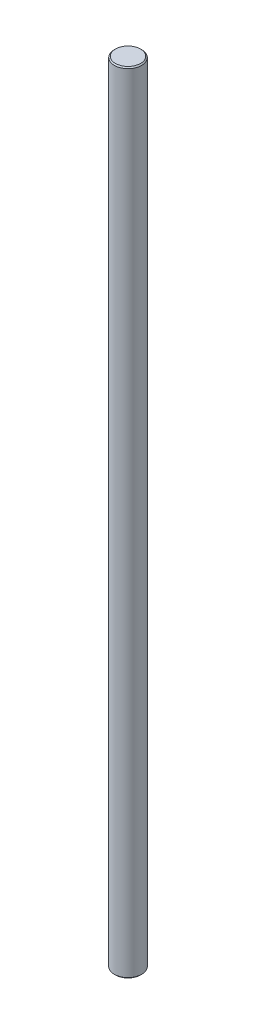
ISO-10303-21;
HEADER;
FILE_DESCRIPTION(('STEP AP214'),'2;1');
FILE_NAME('part.step','',(''),(''),'','','');
FILE_SCHEMA(('AUTOMOTIVE_DESIGN { 1 0 10303 214 1 1 1 1 }'));
ENDSEC;
DATA;
#1=APPLICATION_CONTEXT('core data for automotive mechanical design processes');
#2=APPLICATION_PROTOCOL_DEFINITION('international standard','automotive_design',2000,#1);
#3=PRODUCT_CONTEXT('',#1,'mechanical');
#4=PRODUCT('Part','Part','',(#3));
#5=PRODUCT_RELATED_PRODUCT_CATEGORY('part','',(#4));
#6=PRODUCT_DEFINITION_FORMATION('','',#4);
#7=PRODUCT_DEFINITION_CONTEXT('part definition',#1,'design');
#8=PRODUCT_DEFINITION('design','',#6,#7);
#9=PRODUCT_DEFINITION_SHAPE('','',#8);
#10=(LENGTH_UNIT() NAMED_UNIT(*) SI_UNIT(.MILLI.,.METRE.));
#11=(NAMED_UNIT(*) PLANE_ANGLE_UNIT() SI_UNIT($,.RADIAN.));
#12=(NAMED_UNIT(*) SI_UNIT($,.STERADIAN.) SOLID_ANGLE_UNIT());
#13=UNCERTAINTY_MEASURE_WITH_UNIT(LENGTH_MEASURE(1.E-05),#10,'distance_accuracy_value','');
#14=(GEOMETRIC_REPRESENTATION_CONTEXT(3) GLOBAL_UNCERTAINTY_ASSIGNED_CONTEXT((#13)) GLOBAL_UNIT_ASSIGNED_CONTEXT((#10,
#11,#12)) REPRESENTATION_CONTEXT('',''));
#15=CARTESIAN_POINT('',(0.,0.,0.));
#16=DIRECTION('',(0.,0.,1.));
#17=DIRECTION('',(1.,0.,0.));
#18=AXIS2_PLACEMENT_3D('',#15,#16,#17);
#19=CARTESIAN_POINT('',(-109.028784153227,330.558744459794,1.27442283479538));
#20=DIRECTION('',(0.,-1.,0.));
#21=DIRECTION('',(0.,0.,-1.));
#22=AXIS2_PLACEMENT_3D('',#19,#20,#21);
#23=CYLINDRICAL_SURFACE('',#22,5.99999999999997);
#24=CARTESIAN_POINT('',(-109.028784153227,313.088181711317,1.27442283479538));
#25=DIRECTION('',(0.,1.,0.));
#26=DIRECTION('',(0.,0.,1.));
#27=AXIS2_PLACEMENT_3D('',#24,#25,#26);
#28=CIRCLE('',#27,5.99999999999997);
#29=CARTESIAN_POINT('',(-109.028784153227,313.088181711317,-4.72557716520459));
#30=VERTEX_POINT('',#29);
#31=EDGE_CURVE('E38',#30,#30,#28,.F.);
#32=CARTESIAN_POINT('',(-109.028784153227,-32.4118182886832,1.27442283479537));
#33=DIRECTION('',(0.,1.,0.));
#34=DIRECTION('',(0.,0.,1.));
#35=AXIS2_PLACEMENT_3D('',#32,#33,#34);
#36=CIRCLE('',#35,5.99999999999997);
#37=CARTESIAN_POINT('',(-109.028784153227,-32.4118182886832,-4.72557716520461));
#38=VERTEX_POINT('',#37);
#39=EDGE_CURVE('E42',#38,#38,#36,.T.);
#40=CARTESIAN_POINT('',(-109.028784153227,313.088181711317,-4.72557716520459));
#41=CARTESIAN_POINT('',(-109.028784153227,309.489223377983,-4.72557716520459));
#42=CARTESIAN_POINT('',(-109.028784153227,305.89026504465,-4.72557716520459));
#43=CARTESIAN_POINT('',(-109.028784153227,298.692348377983,-4.72557716520459));
#44=CARTESIAN_POINT('',(-109.028784153227,295.09339004465,-4.72557716520459));
#45=CARTESIAN_POINT('',(-109.028784153227,287.895473377983,-4.72557716520459));
#46=CARTESIAN_POINT('',(-109.028784153227,284.29651504465,-4.72557716520459));
#47=CARTESIAN_POINT('',(-109.028784153227,277.098598377983,-4.72557716520459));
#48=CARTESIAN_POINT('',(-109.028784153227,273.49964004465,-4.72557716520459));
#49=CARTESIAN_POINT('',(-109.028784153227,266.301723377983,-4.72557716520459));
#50=CARTESIAN_POINT('',(-109.028784153227,262.70276504465,-4.7255771652046));
#51=CARTESIAN_POINT('',(-109.028784153227,255.504848377983,-4.7255771652046));
#52=CARTESIAN_POINT('',(-109.028784153227,251.90589004465,-4.7255771652046));
#53=CARTESIAN_POINT('',(-109.028784153227,244.707973377983,-4.7255771652046));
#54=CARTESIAN_POINT('',(-109.028784153227,241.10901504465,-4.7255771652046));
#55=CARTESIAN_POINT('',(-109.028784153227,233.911098377983,-4.7255771652046));
#56=CARTESIAN_POINT('',(-109.028784153227,230.31214004465,-4.7255771652046));
#57=CARTESIAN_POINT('',(-109.028784153227,223.114223377983,-4.7255771652046));
#58=CARTESIAN_POINT('',(-109.028784153227,219.51526504465,-4.7255771652046));
#59=CARTESIAN_POINT('',(-109.028784153227,212.317348377983,-4.7255771652046));
#60=CARTESIAN_POINT('',(-109.028784153227,208.71839004465,-4.7255771652046));
#61=CARTESIAN_POINT('',(-109.028784153227,201.520473377983,-4.7255771652046));
#62=CARTESIAN_POINT('',(-109.028784153227,197.92151504465,-4.7255771652046));
#63=CARTESIAN_POINT('',(-109.028784153227,190.723598377983,-4.7255771652046));
#64=CARTESIAN_POINT('',(-109.028784153227,187.12464004465,-4.7255771652046));
#65=CARTESIAN_POINT('',(-109.028784153227,179.926723377983,-4.7255771652046));
#66=CARTESIAN_POINT('',(-109.028784153227,176.32776504465,-4.7255771652046));
#67=CARTESIAN_POINT('',(-109.028784153227,169.129848377983,-4.7255771652046));
#68=CARTESIAN_POINT('',(-109.028784153227,165.53089004465,-4.7255771652046));
#69=CARTESIAN_POINT('',(-109.028784153227,158.332973377983,-4.7255771652046));
#70=CARTESIAN_POINT('',(-109.028784153227,154.73401504465,-4.7255771652046));
#71=CARTESIAN_POINT('',(-109.028784153227,147.536098377983,-4.7255771652046));
#72=CARTESIAN_POINT('',(-109.028784153227,143.93714004465,-4.7255771652046));
#73=CARTESIAN_POINT('',(-109.028784153227,136.739223377983,-4.7255771652046));
#74=CARTESIAN_POINT('',(-109.028784153227,133.14026504465,-4.7255771652046));
#75=CARTESIAN_POINT('',(-109.028784153227,125.942348377983,-4.7255771652046));
#76=CARTESIAN_POINT('',(-109.028784153227,122.34339004465,-4.7255771652046));
#77=CARTESIAN_POINT('',(-109.028784153227,115.145473377983,-4.7255771652046));
#78=CARTESIAN_POINT('',(-109.028784153227,111.54651504465,-4.7255771652046));
#79=CARTESIAN_POINT('',(-109.028784153227,104.348598377983,-4.7255771652046));
#80=CARTESIAN_POINT('',(-109.028784153227,100.74964004465,-4.7255771652046));
#81=CARTESIAN_POINT('',(-109.028784153227,93.5517233779834,-4.7255771652046));
#82=CARTESIAN_POINT('',(-109.028784153227,89.95276504465,-4.7255771652046));
#83=CARTESIAN_POINT('',(-109.028784153227,82.7548483779834,-4.7255771652046));
#84=CARTESIAN_POINT('',(-109.028784153227,79.1558900446501,-4.7255771652046));
#85=CARTESIAN_POINT('',(-109.028784153227,71.9579733779834,-4.7255771652046));
#86=CARTESIAN_POINT('',(-109.028784153227,68.35901504465,-4.7255771652046));
#87=CARTESIAN_POINT('',(-109.028784153227,61.1610983779834,-4.7255771652046));
#88=CARTESIAN_POINT('',(-109.028784153227,57.5621400446501,-4.7255771652046));
#89=CARTESIAN_POINT('',(-109.028784153227,50.3642233779834,-4.7255771652046));
#90=CARTESIAN_POINT('',(-109.028784153227,46.7652650446501,-4.7255771652046));
#91=CARTESIAN_POINT('',(-109.028784153227,39.5673483779834,-4.7255771652046));
#92=CARTESIAN_POINT('',(-109.028784153227,35.9683900446501,-4.7255771652046));
#93=CARTESIAN_POINT('',(-109.028784153227,28.7704733779834,-4.7255771652046));
#94=CARTESIAN_POINT('',(-109.028784153227,25.1715150446501,-4.7255771652046));
#95=CARTESIAN_POINT('',(-109.028784153227,17.9735983779834,-4.7255771652046));
#96=CARTESIAN_POINT('',(-109.028784153227,14.3746400446501,-4.7255771652046));
#97=CARTESIAN_POINT('',(-109.028784153227,7.1767233779834,-4.7255771652046));
#98=CARTESIAN_POINT('',(-109.028784153227,3.57776504465009,-4.7255771652046));
#99=CARTESIAN_POINT('',(-109.028784153227,-3.62015162201657,-4.7255771652046));
#100=CARTESIAN_POINT('',(-109.028784153227,-7.21910995534991,-4.7255771652046));
#101=CARTESIAN_POINT('',(-109.028784153227,-14.4170266220166,-4.7255771652046));
#102=CARTESIAN_POINT('',(-109.028784153227,-18.0159849553499,-4.72557716520461));
#103=CARTESIAN_POINT('',(-109.028784153227,-25.2139016220166,-4.72557716520461));
#104=CARTESIAN_POINT('',(-109.028784153227,-28.8128599553499,-4.72557716520461));
#105=CARTESIAN_POINT('',(-109.028784153227,-32.4118182886832,-4.72557716520461));
#106=B_SPLINE_CURVE_WITH_KNOTS('',3,(#40,#41,#42,#43,#44,#45,#46,#47,#48,#49,#50,#51,#52,#53,
#54,#55,#56,#57,#58,#59,#60,#61,#62,#63,#64,#65,#66,#67,#68,#69,#70,#71,#72,#73,#74,#75,#76,#77,
#78,#79,#80,#81,#82,#83,#84,#85,#86,#87,#88,#89,#90,#91,#92,#93,#94,#95,#96,#97,#98,#99,#100,
#101,#102,#103,#104,#105),.UNSPECIFIED.,.F.,.F.,(4,2,2,2,2,2,2,2,2,2,2,2,2,2,2,2,2,2,2,2,2,2,2,
2,2,2,2,2,2,2,2,2,4),(0.,10.796875,21.59375,32.390625,43.1875,53.984375,64.78125,75.578125,
86.375,97.171875,107.96875,118.765625,129.5625,140.359375,151.15625,161.953125,172.75,
183.546875,194.34375,205.140625,215.9375,226.734375,237.53125,248.328125,259.125,269.921875,
280.71875,291.515625,302.3125,313.109375,323.90625,334.703125,345.5),.UNSPECIFIED.);
#107=EDGE_CURVE('BSEAM31',#30,#38,#106,.T.);
#108=ORIENTED_EDGE('',*,*,#31,.T.);
#109=ORIENTED_EDGE('',*,*,#39,.T.);
#110=ORIENTED_EDGE('',*,*,#107,.T.);
#111=ORIENTED_EDGE('',*,*,#107,.F.);
#112=EDGE_LOOP('',(#108,#110,#109,#111));
#113=FACE_BOUND('',#112,.T.);
#114=ADVANCED_FACE('F31',(#113),#23,.T.);
#115=CARTESIAN_POINT('',(-109.028784153227,-32.9118182886834,1.27442283479537));
#116=DIRECTION('',(0.,1.,0.));
#117=DIRECTION('',(0.,0.,1.));
#118=AXIS2_PLACEMENT_3D('',#115,#116,#117);
#119=PLANE('',#118);
#120=CARTESIAN_POINT('',(-109.028784153227,-32.9118182886834,1.27442283479537));
#121=DIRECTION('',(0.,1.,0.));
#122=DIRECTION('',(0.,0.,1.));
#123=AXIS2_PLACEMENT_3D('',#120,#121,#122);
#124=CIRCLE('',#123,5.4999999999997);
#125=CARTESIAN_POINT('',(-109.028784153227,-32.9118182886834,6.77442283479507));
#126=VERTEX_POINT('',#125);
#127=EDGE_CURVE('E10',#126,#126,#124,.F.);
#128=ORIENTED_EDGE('',*,*,#127,.T.);
#129=EDGE_LOOP('',(#128));
#130=FACE_BOUND('',#129,.T.);
#131=ADVANCED_FACE('F62',(#130),#119,.F.);
#132=CARTESIAN_POINT('',(-109.028784153227,313.588181711317,0.274422834795368));
#133=DIRECTION('',(0.,1.,0.));
#134=DIRECTION('',(-1.,0.,0.));
#135=AXIS2_PLACEMENT_3D('',#132,#133,#134);
#136=PLANE('',#135);
#137=CARTESIAN_POINT('',(-109.028784153227,313.588181711317,1.27442283479538));
#138=DIRECTION('',(0.,1.,0.));
#139=DIRECTION('',(0.,0.,1.));
#140=AXIS2_PLACEMENT_3D('',#137,#138,#139);
#141=CIRCLE('',#140,5.50000000000006);
#142=CARTESIAN_POINT('',(-109.028784153227,313.588181711317,6.77442283479544));
#143=VERTEX_POINT('',#142);
#144=EDGE_CURVE('E46',#143,#143,#141,.T.);
#145=ORIENTED_EDGE('',*,*,#144,.T.);
#146=EDGE_LOOP('',(#145));
#147=FACE_BOUND('',#146,.T.);
#148=ADVANCED_FACE('F52',(#147),#136,.T.);
#149=CARTESIAN_POINT('',(-109.028784153227,313.588181711317,1.27442283479538));
#150=DIRECTION('',(0.,-1.,0.));
#151=DIRECTION('',(0.,0.,-1.));
#152=AXIS2_PLACEMENT_3D('',#149,#150,#151);
#153=CONICAL_SURFACE('',#152,5.50000000000006,0.785398163397418);
#154=ORIENTED_EDGE('',*,*,#31,.F.);
#155=EDGE_LOOP('',(#154));
#156=FACE_BOUND('',#155,.T.);
#157=ORIENTED_EDGE('',*,*,#144,.F.);
#158=EDGE_LOOP('',(#157));
#159=FACE_BOUND('',#158,.T.);
#160=ADVANCED_FACE('F54',(#156,#159),#153,.T.);
#161=CARTESIAN_POINT('',(-109.028784153227,-32.4118182886832,1.27442283479537));
#162=DIRECTION('',(0.,1.,0.));
#163=DIRECTION('',(0.,0.,1.));
#164=AXIS2_PLACEMENT_3D('',#161,#162,#163);
#165=CONICAL_SURFACE('',#164,5.99999999999997,0.785398163397445);
#166=ORIENTED_EDGE('',*,*,#127,.F.);
#167=EDGE_LOOP('',(#166));
#168=FACE_BOUND('',#167,.T.);
#169=ORIENTED_EDGE('',*,*,#39,.F.);
#170=EDGE_LOOP('',(#169));
#171=FACE_BOUND('',#170,.T.);
#172=ADVANCED_FACE('F33',(#168,#171),#165,.T.);
#173=CLOSED_SHELL('',(#114,#131,#148,#160,#172));
#174=MANIFOLD_SOLID_BREP('B2',#173);
#175=ADVANCED_BREP_SHAPE_REPRESENTATION('',(#18,#174),#14);
#176=SHAPE_DEFINITION_REPRESENTATION(#9,#175);
ENDSEC;
END-ISO-10303-21;
